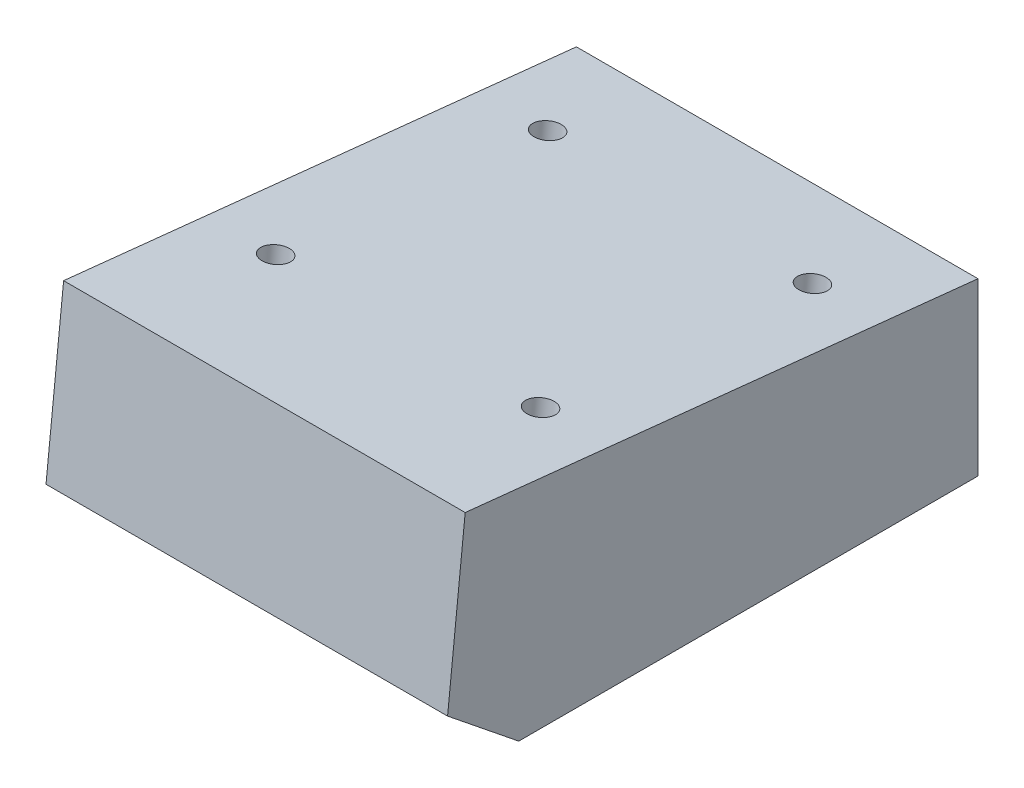
ISO-10303-21;
HEADER;
FILE_DESCRIPTION(('STEP AP214'),'2;1');
FILE_NAME('part.step','',(''),(''),'','','');
FILE_SCHEMA(('AUTOMOTIVE_DESIGN { 1 0 10303 214 1 1 1 1 }'));
ENDSEC;
DATA;
#1=APPLICATION_CONTEXT('core data for automotive mechanical design processes');
#2=APPLICATION_PROTOCOL_DEFINITION('international standard','automotive_design',2000,#1);
#3=PRODUCT_CONTEXT('',#1,'mechanical');
#4=PRODUCT('Part','Part','',(#3));
#5=PRODUCT_RELATED_PRODUCT_CATEGORY('part','',(#4));
#6=PRODUCT_DEFINITION_FORMATION('','',#4);
#7=PRODUCT_DEFINITION_CONTEXT('part definition',#1,'design');
#8=PRODUCT_DEFINITION('design','',#6,#7);
#9=PRODUCT_DEFINITION_SHAPE('','',#8);
#10=(LENGTH_UNIT() NAMED_UNIT(*) SI_UNIT(.MILLI.,.METRE.));
#11=(NAMED_UNIT(*) PLANE_ANGLE_UNIT() SI_UNIT($,.RADIAN.));
#12=(NAMED_UNIT(*) SI_UNIT($,.STERADIAN.) SOLID_ANGLE_UNIT());
#13=UNCERTAINTY_MEASURE_WITH_UNIT(LENGTH_MEASURE(1.E-05),#10,'distance_accuracy_value','');
#14=(GEOMETRIC_REPRESENTATION_CONTEXT(3) GLOBAL_UNCERTAINTY_ASSIGNED_CONTEXT((#13)) GLOBAL_UNIT_ASSIGNED_CONTEXT((#10,
#11,#12)) REPRESENTATION_CONTEXT('',''));
#15=CARTESIAN_POINT('',(0.,0.,0.));
#16=DIRECTION('',(0.,0.,1.));
#17=DIRECTION('',(1.,0.,0.));
#18=AXIS2_PLACEMENT_3D('',#15,#16,#17);
#19=CARTESIAN_POINT('',(-91.9229512232597,0.,0.));
#20=DIRECTION('',(0.,-1.,0.));
#21=DIRECTION('',(0.,0.,-1.));
#22=AXIS2_PLACEMENT_3D('',#19,#20,#21);
#23=PLANE('',#22);
#24=DIRECTION('',(0.,0.,-1.));
#25=VECTOR('',#24,1.);
#26=CARTESIAN_POINT('',(-22.5999999999999,0.,0.));
#27=LINE('',#26,#25);
#28=CARTESIAN_POINT('',(-22.5999999999999,0.,0.));
#29=VERTEX_POINT('',#28);
#30=CARTESIAN_POINT('',(-22.5999999999999,0.,-53.75));
#31=VERTEX_POINT('',#30);
#32=EDGE_CURVE('E153',#29,#31,#27,.T.);
#33=ORIENTED_EDGE('',*,*,#32,.F.);
#34=DIRECTION('',(1.,0.,0.));
#35=VECTOR('',#34,1.);
#36=CARTESIAN_POINT('',(-91.9229512232597,0.,0.));
#37=LINE('',#36,#35);
#38=CARTESIAN_POINT('',(-23.4999999999999,0.,0.));
#39=VERTEX_POINT('',#38);
#40=EDGE_CURVE('E212',#39,#29,#37,.T.);
#41=ORIENTED_EDGE('',*,*,#40,.F.);
#42=DIRECTION('',(0.,0.,1.));
#43=VECTOR('',#42,1.);
#44=CARTESIAN_POINT('',(-23.4999999999999,0.,0.));
#45=LINE('',#44,#43);
#46=CARTESIAN_POINT('',(-23.4999999999999,0.,-53.75));
#47=VERTEX_POINT('',#46);
#48=EDGE_CURVE('E198',#47,#39,#45,.T.);
#49=ORIENTED_EDGE('',*,*,#48,.F.);
#50=DIRECTION('',(1.,0.,0.));
#51=VECTOR('',#50,1.);
#52=CARTESIAN_POINT('',(-91.9229512232597,0.,-53.75));
#53=LINE('',#52,#51);
#54=EDGE_CURVE('E208',#47,#31,#53,.T.);
#55=ORIENTED_EDGE('',*,*,#54,.T.);
#56=EDGE_LOOP('',(#33,#41,#49,#55));
#57=FACE_BOUND('',#56,.T.);
#58=ADVANCED_FACE('F33',(#57),#23,.T.);
#59=CARTESIAN_POINT('',(-91.9229512232597,6.70267714112102,8.32847136590357));
#60=DIRECTION('',(0.,0.104528463267645,0.994521895368274));
#61=DIRECTION('',(0.,-0.994521895368274,0.104528463267645));
#62=AXIS2_PLACEMENT_3D('',#59,#60,#61);
#63=PLANE('',#62);
#64=DIRECTION('',(0.,0.994521895368274,-0.104528463267645));
#65=VECTOR('',#64,1.);
#66=CARTESIAN_POINT('',(-23.4999999999999,6.70267714112102,8.32847136590357));
#67=LINE('',#66,#65);
#68=CARTESIAN_POINT('',(-23.4999999999999,6.70267714112102,8.32847136590357));
#69=VERTEX_POINT('',#68);
#70=CARTESIAN_POINT('',(-23.4999999999999,26.3081307683911,6.26785515537283));
#71=VERTEX_POINT('',#70);
#72=EDGE_CURVE('E41',#69,#71,#67,.T.);
#73=ORIENTED_EDGE('',*,*,#72,.F.);
#74=DIRECTION('',(1.,0.,0.));
#75=VECTOR('',#74,1.);
#76=CARTESIAN_POINT('',(-91.9229512232597,6.70267714112102,8.32847136590357));
#77=LINE('',#76,#75);
#78=CARTESIAN_POINT('',(23.4999999999999,6.70267714112102,8.32847136590357));
#79=VERTEX_POINT('',#78);
#80=EDGE_CURVE('E195',#69,#79,#77,.T.);
#81=ORIENTED_EDGE('',*,*,#80,.T.);
#82=DIRECTION('',(0.,0.994521895368274,-0.104528463267645));
#83=VECTOR('',#82,1.);
#84=CARTESIAN_POINT('',(23.4999999999999,6.70267714112102,8.32847136590357));
#85=LINE('',#84,#83);
#86=CARTESIAN_POINT('',(23.4999999999999,26.3081307683911,6.26785515537283));
#87=VERTEX_POINT('',#86);
#88=EDGE_CURVE('E192',#79,#87,#85,.T.);
#89=ORIENTED_EDGE('',*,*,#88,.T.);
#90=DIRECTION('',(1.,0.,0.));
#91=VECTOR('',#90,1.);
#92=CARTESIAN_POINT('',(-91.9229512232597,26.3081307683911,6.26785515537283));
#93=LINE('',#92,#91);
#94=EDGE_CURVE('E200',#71,#87,#93,.T.);
#95=ORIENTED_EDGE('',*,*,#94,.F.);
#96=EDGE_LOOP('',(#73,#81,#89,#95));
#97=FACE_BOUND('',#96,.T.);
#98=ADVANCED_FACE('F35',(#97),#63,.T.);
#99=CARTESIAN_POINT('',(-91.9229512232597,20.,-53.75));
#100=DIRECTION('',(0.,0.994521895368274,-0.104528463267646));
#101=DIRECTION('',(0.,0.104528463267646,0.994521895368274));
#102=AXIS2_PLACEMENT_3D('',#99,#100,#101);
#103=PLANE('',#102);
#104=CARTESIAN_POINT('',(-15.5,24.5402929855246,-10.5519978067653));
#105=DIRECTION('',(0.,0.994521895368274,-0.104528463267646));
#106=DIRECTION('',(0.,0.104528463267646,0.994521895368274));
#107=AXIS2_PLACEMENT_3D('',#104,#105,#106);
#108=CIRCLE('',#107,1.6);
#109=CARTESIAN_POINT('',(-15.5,24.7075385267529,-8.9607627741761));
#110=VERTEX_POINT('',#109);
#111=EDGE_CURVE('E132',#110,#110,#108,.T.);
#112=ORIENTED_EDGE('',*,*,#111,.F.);
#113=EDGE_LOOP('',(#112));
#114=FACE_BOUND('',#113,.T.);
#115=CARTESIAN_POINT('',(15.5,24.5402929855246,-10.5519978067653));
#116=DIRECTION('',(0.,0.994521895368274,-0.104528463267646));
#117=DIRECTION('',(0.,0.104528463267646,0.994521895368274));
#118=AXIS2_PLACEMENT_3D('',#115,#116,#117);
#119=CIRCLE('',#118,1.6);
#120=CARTESIAN_POINT('',(15.5,24.7075385267529,-8.9607627741761));
#121=VERTEX_POINT('',#120);
#122=EDGE_CURVE('E138',#121,#121,#119,.T.);
#123=ORIENTED_EDGE('',*,*,#122,.F.);
#124=EDGE_LOOP('',(#123));
#125=FACE_BOUND('',#124,.T.);
#126=CARTESIAN_POINT('',(15.5,21.1953821609599,-42.3766984585501));
#127=DIRECTION('',(0.,0.994521895368274,-0.104528463267646));
#128=DIRECTION('',(0.,0.104528463267646,0.994521895368274));
#129=AXIS2_PLACEMENT_3D('',#126,#127,#128);
#130=CIRCLE('',#129,1.6);
#131=CARTESIAN_POINT('',(15.5,21.3626277021882,-40.7854634259609));
#132=VERTEX_POINT('',#131);
#133=EDGE_CURVE('E144',#132,#132,#130,.T.);
#134=ORIENTED_EDGE('',*,*,#133,.F.);
#135=EDGE_LOOP('',(#134));
#136=FACE_BOUND('',#135,.T.);
#137=CARTESIAN_POINT('',(-15.5,21.1953821609599,-42.3766984585501));
#138=DIRECTION('',(0.,0.994521895368274,-0.104528463267646));
#139=DIRECTION('',(0.,0.104528463267646,0.994521895368274));
#140=AXIS2_PLACEMENT_3D('',#137,#138,#139);
#141=CIRCLE('',#140,1.60000000000001);
#142=CARTESIAN_POINT('',(-15.5,21.3626277021882,-40.7854634259609));
#143=VERTEX_POINT('',#142);
#144=EDGE_CURVE('E150',#143,#143,#141,.T.);
#145=ORIENTED_EDGE('',*,*,#144,.F.);
#146=EDGE_LOOP('',(#145));
#147=FACE_BOUND('',#146,.T.);
#148=DIRECTION('',(0.,-0.104528463267646,-0.994521895368274));
#149=VECTOR('',#148,1.);
#150=CARTESIAN_POINT('',(-23.4999999999999,20.,-53.75));
#151=LINE('',#150,#149);
#152=CARTESIAN_POINT('',(-23.4999999999999,20.,-53.75));
#153=VERTEX_POINT('',#152);
#154=EDGE_CURVE('E202',#71,#153,#151,.T.);
#155=ORIENTED_EDGE('',*,*,#154,.F.);
#156=ORIENTED_EDGE('',*,*,#94,.T.);
#157=DIRECTION('',(0.,-0.104528463267646,-0.994521895368274));
#158=VECTOR('',#157,1.);
#159=CARTESIAN_POINT('',(23.4999999999999,20.,-53.75));
#160=LINE('',#159,#158);
#161=CARTESIAN_POINT('',(23.4999999999999,20.,-53.75));
#162=VERTEX_POINT('',#161);
#163=EDGE_CURVE('E176',#87,#162,#160,.T.);
#164=ORIENTED_EDGE('',*,*,#163,.T.);
#165=DIRECTION('',(1.,0.,0.));
#166=VECTOR('',#165,1.);
#167=CARTESIAN_POINT('',(-91.9229512232597,20.,-53.75));
#168=LINE('',#167,#166);
#169=EDGE_CURVE('E206',#153,#162,#168,.T.);
#170=ORIENTED_EDGE('',*,*,#169,.F.);
#171=EDGE_LOOP('',(#155,#156,#164,#170));
#172=FACE_BOUND('',#171,.T.);
#173=ADVANCED_FACE('F237',(#114,#125,#136,#147,#172),#103,.T.);
#174=CARTESIAN_POINT('',(-91.9229512232597,0.,-53.75));
#175=DIRECTION('',(0.,0.,-1.));
#176=DIRECTION('',(-1.,0.,0.));
#177=AXIS2_PLACEMENT_3D('',#174,#175,#176);
#178=PLANE('',#177);
#179=DIRECTION('',(0.,-1.,0.));
#180=VECTOR('',#179,1.);
#181=CARTESIAN_POINT('',(-22.5999999999999,4.05,-53.75));
#182=LINE('',#181,#180);
#183=CARTESIAN_POINT('',(-22.5999999999999,4.05,-53.75));
#184=VERTEX_POINT('',#183);
#185=EDGE_CURVE('E169',#184,#31,#182,.T.);
#186=ORIENTED_EDGE('',*,*,#185,.T.);
#187=ORIENTED_EDGE('',*,*,#54,.F.);
#188=DIRECTION('',(0.,-1.,0.));
#189=VECTOR('',#188,1.);
#190=CARTESIAN_POINT('',(-23.4999999999999,0.,-53.75));
#191=LINE('',#190,#189);
#192=EDGE_CURVE('E57',#153,#47,#191,.T.);
#193=ORIENTED_EDGE('',*,*,#192,.F.);
#194=ORIENTED_EDGE('',*,*,#169,.T.);
#195=DIRECTION('',(0.,-1.,0.));
#196=VECTOR('',#195,1.);
#197=CARTESIAN_POINT('',(23.4999999999999,0.,-53.75));
#198=LINE('',#197,#196);
#199=CARTESIAN_POINT('',(23.4999999999999,0.,-53.75));
#200=VERTEX_POINT('',#199);
#201=EDGE_CURVE('E183',#162,#200,#198,.T.);
#202=ORIENTED_EDGE('',*,*,#201,.T.);
#203=CARTESIAN_POINT('',(22.5999999999999,0.,-53.75));
#204=VERTEX_POINT('',#203);
#205=EDGE_CURVE('E211',#204,#200,#53,.T.);
#206=ORIENTED_EDGE('',*,*,#205,.F.);
#207=DIRECTION('',(0.,-1.,0.));
#208=VECTOR('',#207,1.);
#209=CARTESIAN_POINT('',(22.5999999999999,4.05,-53.75));
#210=LINE('',#209,#208);
#211=CARTESIAN_POINT('',(22.5999999999999,4.05,-53.75));
#212=VERTEX_POINT('',#211);
#213=EDGE_CURVE('E179',#212,#204,#210,.T.);
#214=ORIENTED_EDGE('',*,*,#213,.F.);
#215=DIRECTION('',(1.,0.,0.));
#216=VECTOR('',#215,1.);
#217=CARTESIAN_POINT('',(-22.5999999999999,4.05,-53.75));
#218=LINE('',#217,#216);
#219=EDGE_CURVE('E159',#184,#212,#218,.T.);
#220=ORIENTED_EDGE('',*,*,#219,.F.);
#221=EDGE_LOOP('',(#186,#187,#193,#194,#202,#206,#214,#220));
#222=FACE_BOUND('',#221,.T.);
#223=ADVANCED_FACE('F233',(#222),#178,.T.);
#224=DIRECTION('',(0.,0.,1.));
#225=VECTOR('',#224,1.);
#226=CARTESIAN_POINT('',(22.5999999999999,0.,0.));
#227=LINE('',#226,#225);
#228=CARTESIAN_POINT('',(22.5999999999999,0.,0.));
#229=VERTEX_POINT('',#228);
#230=EDGE_CURVE('E48',#204,#229,#227,.T.);
#231=ORIENTED_EDGE('',*,*,#230,.F.);
#232=ORIENTED_EDGE('',*,*,#205,.T.);
#233=DIRECTION('',(0.,0.,1.));
#234=VECTOR('',#233,1.);
#235=CARTESIAN_POINT('',(23.4999999999999,0.,0.));
#236=LINE('',#235,#234);
#237=CARTESIAN_POINT('',(23.4999999999999,0.,0.));
#238=VERTEX_POINT('',#237);
#239=EDGE_CURVE('E186',#200,#238,#236,.T.);
#240=ORIENTED_EDGE('',*,*,#239,.T.);
#241=EDGE_CURVE('E214',#229,#238,#37,.T.);
#242=ORIENTED_EDGE('',*,*,#241,.F.);
#243=EDGE_LOOP('',(#231,#232,#240,#242));
#244=FACE_BOUND('',#243,.T.);
#245=ADVANCED_FACE('F229',(#244),#23,.T.);
#246=CARTESIAN_POINT('',(-91.9229512232597,0.,0.));
#247=DIRECTION('',(0.,-0.779044883952261,0.626968156119438));
#248=DIRECTION('',(0.,-0.626968156119438,-0.779044883952261));
#249=AXIS2_PLACEMENT_3D('',#246,#247,#248);
#250=PLANE('',#249);
#251=CARTESIAN_POINT('',(-13.4999999999999,3.4785766463036,4.32233649075853));
#252=DIRECTION('',(0.,-0.779044883952261,0.626968156119438));
#253=DIRECTION('',(0.,-0.626968156119438,-0.779044883952261));
#254=AXIS2_PLACEMENT_3D('',#251,#252,#253);
#255=CIRCLE('',#254,1.24999999999999);
#256=CARTESIAN_POINT('',(-13.4999999999999,2.69486645115431,3.34853038581821));
#257=VERTEX_POINT('',#256);
#258=EDGE_CURVE('E121',#257,#257,#255,.T.);
#259=ORIENTED_EDGE('',*,*,#258,.F.);
#260=EDGE_LOOP('',(#259));
#261=FACE_BOUND('',#260,.T.);
#262=CARTESIAN_POINT('',(13.4999999999999,3.4785766463036,4.32233649075852));
#263=DIRECTION('',(0.,-0.779044883952261,0.626968156119438));
#264=DIRECTION('',(0.,-0.626968156119438,-0.779044883952261));
#265=AXIS2_PLACEMENT_3D('',#262,#263,#264);
#266=CIRCLE('',#265,1.24999999999999);
#267=CARTESIAN_POINT('',(13.4999999999999,2.69486645115431,3.34853038581821));
#268=VERTEX_POINT('',#267);
#269=EDGE_CURVE('E120',#268,#268,#266,.T.);
#270=ORIENTED_EDGE('',*,*,#269,.F.);
#271=EDGE_LOOP('',(#270));
#272=FACE_BOUND('',#271,.T.);
#273=DIRECTION('',(0.,0.626968156119438,0.779044883952261));
#274=VECTOR('',#273,1.);
#275=CARTESIAN_POINT('',(-23.4999999999999,0.,0.));
#276=LINE('',#275,#274);
#277=EDGE_CURVE('E11',#39,#69,#276,.T.);
#278=ORIENTED_EDGE('',*,*,#277,.F.);
#279=ORIENTED_EDGE('',*,*,#40,.T.);
#280=DIRECTION('',(-1.,0.,0.));
#281=VECTOR('',#280,1.);
#282=CARTESIAN_POINT('',(-22.5999999999999,0.,0.));
#283=LINE('',#282,#281);
#284=EDGE_CURVE('E160',#229,#29,#283,.T.);
#285=ORIENTED_EDGE('',*,*,#284,.F.);
#286=ORIENTED_EDGE('',*,*,#241,.T.);
#287=DIRECTION('',(0.,0.626968156119438,0.779044883952261));
#288=VECTOR('',#287,1.);
#289=CARTESIAN_POINT('',(23.4999999999999,0.,0.));
#290=LINE('',#289,#288);
#291=EDGE_CURVE('E189',#238,#79,#290,.T.);
#292=ORIENTED_EDGE('',*,*,#291,.T.);
#293=ORIENTED_EDGE('',*,*,#80,.F.);
#294=EDGE_LOOP('',(#278,#279,#285,#286,#292,#293));
#295=FACE_BOUND('',#294,.T.);
#296=ADVANCED_FACE('F222',(#261,#272,#295),#250,.T.);
#297=CARTESIAN_POINT('',(-23.4999999999999,0.0499999999999997,0.));
#298=DIRECTION('',(1.,0.,0.));
#299=DIRECTION('',(0.,0.,-1.));
#300=AXIS2_PLACEMENT_3D('',#297,#298,#299);
#301=PLANE('',#300);
#302=ORIENTED_EDGE('',*,*,#72,.T.);
#303=ORIENTED_EDGE('',*,*,#154,.T.);
#304=ORIENTED_EDGE('',*,*,#192,.T.);
#305=ORIENTED_EDGE('',*,*,#48,.T.);
#306=ORIENTED_EDGE('',*,*,#277,.T.);
#307=EDGE_LOOP('',(#302,#303,#304,#305,#306));
#308=FACE_BOUND('',#307,.T.);
#309=ADVANCED_FACE('F274',(#308),#301,.F.);
#310=CARTESIAN_POINT('',(23.4999999999999,0.0499999999999997,0.));
#311=DIRECTION('',(-1.,0.,0.));
#312=DIRECTION('',(0.,0.,1.));
#313=AXIS2_PLACEMENT_3D('',#310,#311,#312);
#314=PLANE('',#313);
#315=ORIENTED_EDGE('',*,*,#291,.F.);
#316=ORIENTED_EDGE('',*,*,#239,.F.);
#317=ORIENTED_EDGE('',*,*,#201,.F.);
#318=ORIENTED_EDGE('',*,*,#163,.F.);
#319=ORIENTED_EDGE('',*,*,#88,.F.);
#320=EDGE_LOOP('',(#315,#316,#317,#318,#319));
#321=FACE_BOUND('',#320,.T.);
#322=ADVANCED_FACE('F226',(#321),#314,.F.);
#323=CARTESIAN_POINT('',(-22.5999999999999,4.05,0.));
#324=DIRECTION('',(-1.,0.,0.));
#325=DIRECTION('',(0.,0.,1.));
#326=AXIS2_PLACEMENT_3D('',#323,#324,#325);
#327=PLANE('',#326);
#328=ORIENTED_EDGE('',*,*,#32,.T.);
#329=ORIENTED_EDGE('',*,*,#185,.F.);
#330=DIRECTION('',(0.,0.,-1.));
#331=VECTOR('',#330,1.);
#332=CARTESIAN_POINT('',(-22.5999999999999,4.05,0.));
#333=LINE('',#332,#331);
#334=CARTESIAN_POINT('',(-22.5999999999999,4.05,0.));
#335=VERTEX_POINT('',#334);
#336=EDGE_CURVE('E156',#335,#184,#333,.T.);
#337=ORIENTED_EDGE('',*,*,#336,.F.);
#338=DIRECTION('',(0.,-1.,0.));
#339=VECTOR('',#338,1.);
#340=CARTESIAN_POINT('',(-22.5999999999999,4.05,0.));
#341=LINE('',#340,#339);
#342=EDGE_CURVE('E174',#335,#29,#341,.T.);
#343=ORIENTED_EDGE('',*,*,#342,.T.);
#344=EDGE_LOOP('',(#328,#329,#337,#343));
#345=FACE_BOUND('',#344,.T.);
#346=ADVANCED_FACE('F244',(#345),#327,.F.);
#347=CARTESIAN_POINT('',(-22.5999999999999,4.05,0.));
#348=DIRECTION('',(0.,0.,1.));
#349=DIRECTION('',(1.,0.,0.));
#350=AXIS2_PLACEMENT_3D('',#347,#348,#349);
#351=PLANE('',#350);
#352=ORIENTED_EDGE('',*,*,#284,.T.);
#353=ORIENTED_EDGE('',*,*,#342,.F.);
#354=DIRECTION('',(-1.,0.,0.));
#355=VECTOR('',#354,1.);
#356=CARTESIAN_POINT('',(-22.5999999999999,4.05,0.));
#357=LINE('',#356,#355);
#358=CARTESIAN_POINT('',(22.5999999999999,4.05,0.));
#359=VERTEX_POINT('',#358);
#360=EDGE_CURVE('E166',#359,#335,#357,.T.);
#361=ORIENTED_EDGE('',*,*,#360,.F.);
#362=DIRECTION('',(0.,-1.,0.));
#363=VECTOR('',#362,1.);
#364=CARTESIAN_POINT('',(22.5999999999999,4.05,0.));
#365=LINE('',#364,#363);
#366=EDGE_CURVE('E177',#359,#229,#365,.T.);
#367=ORIENTED_EDGE('',*,*,#366,.T.);
#368=EDGE_LOOP('',(#352,#353,#361,#367));
#369=FACE_BOUND('',#368,.T.);
#370=ADVANCED_FACE('F250',(#369),#351,.F.);
#371=CARTESIAN_POINT('',(22.5999999999999,4.05,0.));
#372=DIRECTION('',(1.,0.,0.));
#373=DIRECTION('',(0.,0.,-1.));
#374=AXIS2_PLACEMENT_3D('',#371,#372,#373);
#375=PLANE('',#374);
#376=ORIENTED_EDGE('',*,*,#230,.T.);
#377=ORIENTED_EDGE('',*,*,#366,.F.);
#378=DIRECTION('',(0.,0.,1.));
#379=VECTOR('',#378,1.);
#380=CARTESIAN_POINT('',(22.5999999999999,4.05,0.));
#381=LINE('',#380,#379);
#382=EDGE_CURVE('E163',#212,#359,#381,.T.);
#383=ORIENTED_EDGE('',*,*,#382,.F.);
#384=ORIENTED_EDGE('',*,*,#213,.T.);
#385=EDGE_LOOP('',(#376,#377,#383,#384));
#386=FACE_BOUND('',#385,.T.);
#387=ADVANCED_FACE('F251',(#386),#375,.F.);
#388=CARTESIAN_POINT('',(0.,4.05,0.));
#389=DIRECTION('',(0.,-1.,0.));
#390=DIRECTION('',(0.,0.,-1.));
#391=AXIS2_PLACEMENT_3D('',#388,#389,#390);
#392=PLANE('',#391);
#393=CARTESIAN_POINT('',(-15.5,4.05,-8.39838123215227));
#394=DIRECTION('',(0.,-1.,0.));
#395=DIRECTION('',(0.,0.,-1.));
#396=AXIS2_PLACEMENT_3D('',#393,#394,#395);
#397=ELLIPSE('',#396,1.60881324730163,1.6);
#398=CARTESIAN_POINT('',(-15.5,4.05,-10.0071944794539));
#399=VERTEX_POINT('',#398);
#400=EDGE_CURVE('E131',#399,#399,#397,.F.);
#401=ORIENTED_EDGE('',*,*,#400,.T.);
#402=EDGE_LOOP('',(#401));
#403=FACE_BOUND('',#402,.T.);
#404=CARTESIAN_POINT('',(15.5,4.05,-8.39838123215227));
#405=DIRECTION('',(0.,-1.,0.));
#406=DIRECTION('',(0.,0.,-1.));
#407=AXIS2_PLACEMENT_3D('',#404,#405,#406);
#408=ELLIPSE('',#407,1.60881324730163,1.6);
#409=CARTESIAN_POINT('',(15.5,4.05,-10.0071944794539));
#410=VERTEX_POINT('',#409);
#411=EDGE_CURVE('E135',#410,#410,#408,.F.);
#412=ORIENTED_EDGE('',*,*,#411,.T.);
#413=EDGE_LOOP('',(#412));
#414=FACE_BOUND('',#413,.T.);
#415=CARTESIAN_POINT('',(15.5,4.05,-40.5746461781848));
#416=DIRECTION('',(0.,-1.,0.));
#417=DIRECTION('',(0.,0.,-1.));
#418=AXIS2_PLACEMENT_3D('',#415,#416,#417);
#419=ELLIPSE('',#418,1.60881324730163,1.6);
#420=CARTESIAN_POINT('',(15.5,4.05,-42.1834594254864));
#421=VERTEX_POINT('',#420);
#422=EDGE_CURVE('E141',#421,#421,#419,.F.);
#423=ORIENTED_EDGE('',*,*,#422,.T.);
#424=EDGE_LOOP('',(#423));
#425=FACE_BOUND('',#424,.T.);
#426=CARTESIAN_POINT('',(-15.5,4.05,-40.5746461781848));
#427=DIRECTION('',(0.,-1.,0.));
#428=DIRECTION('',(0.,0.,-1.));
#429=AXIS2_PLACEMENT_3D('',#426,#427,#428);
#430=ELLIPSE('',#429,1.60881324730163,1.60000000000001);
#431=CARTESIAN_POINT('',(-15.5,4.05,-42.1834594254864));
#432=VERTEX_POINT('',#431);
#433=EDGE_CURVE('E147',#432,#432,#430,.F.);
#434=ORIENTED_EDGE('',*,*,#433,.T.);
#435=EDGE_LOOP('',(#434));
#436=FACE_BOUND('',#435,.T.);
#437=ORIENTED_EDGE('',*,*,#336,.T.);
#438=ORIENTED_EDGE('',*,*,#219,.T.);
#439=ORIENTED_EDGE('',*,*,#382,.T.);
#440=ORIENTED_EDGE('',*,*,#360,.T.);
#441=EDGE_LOOP('',(#437,#438,#439,#440));
#442=FACE_BOUND('',#441,.T.);
#443=ADVANCED_FACE('F247',(#403,#414,#425,#436,#442),#392,.T.);
#444=CARTESIAN_POINT('',(-15.5,-5.04060684855692,-39.6191848972663));
#445=DIRECTION('',(0.,0.994521895368274,-0.104528463267646));
#446=DIRECTION('',(0.,0.104528463267646,0.994521895368274));
#447=AXIS2_PLACEMENT_3D('',#444,#445,#446);
#448=CYLINDRICAL_SURFACE('',#447,1.60000000000001);
#449=ORIENTED_EDGE('',*,*,#433,.F.);
#450=EDGE_LOOP('',(#449));
#451=FACE_BOUND('',#450,.T.);
#452=ORIENTED_EDGE('',*,*,#144,.T.);
#453=EDGE_LOOP('',(#452));
#454=FACE_BOUND('',#453,.T.);
#455=ADVANCED_FACE('F258',(#451,#454),#448,.F.);
#456=CARTESIAN_POINT('',(15.5,-5.04060684855692,-39.6191848972663));
#457=DIRECTION('',(0.,0.994521895368274,-0.104528463267646));
#458=DIRECTION('',(0.,0.104528463267646,0.994521895368274));
#459=AXIS2_PLACEMENT_3D('',#456,#457,#458);
#460=CYLINDRICAL_SURFACE('',#459,1.6);
#461=ORIENTED_EDGE('',*,*,#422,.F.);
#462=EDGE_LOOP('',(#461));
#463=FACE_BOUND('',#462,.T.);
#464=ORIENTED_EDGE('',*,*,#133,.T.);
#465=EDGE_LOOP('',(#464));
#466=FACE_BOUND('',#465,.T.);
#467=ADVANCED_FACE('F321',(#463,#466),#460,.F.);
#468=CARTESIAN_POINT('',(15.5,-1.69569602399224,-7.79448424548157));
#469=DIRECTION('',(0.,0.994521895368274,-0.104528463267646));
#470=DIRECTION('',(0.,0.104528463267646,0.994521895368274));
#471=AXIS2_PLACEMENT_3D('',#468,#469,#470);
#472=CYLINDRICAL_SURFACE('',#471,1.6);
#473=ORIENTED_EDGE('',*,*,#411,.F.);
#474=EDGE_LOOP('',(#473));
#475=FACE_BOUND('',#474,.T.);
#476=ORIENTED_EDGE('',*,*,#122,.T.);
#477=EDGE_LOOP('',(#476));
#478=FACE_BOUND('',#477,.T.);
#479=ADVANCED_FACE('F331',(#475,#478),#472,.F.);
#480=CARTESIAN_POINT('',(-15.5,-1.69569602399224,-7.79448424548157));
#481=DIRECTION('',(0.,0.994521895368274,-0.104528463267646));
#482=DIRECTION('',(0.,0.104528463267646,0.994521895368274));
#483=AXIS2_PLACEMENT_3D('',#480,#481,#482);
#484=CYLINDRICAL_SURFACE('',#483,1.6);
#485=ORIENTED_EDGE('',*,*,#400,.F.);
#486=EDGE_LOOP('',(#485));
#487=FACE_BOUND('',#486,.T.);
#488=ORIENTED_EDGE('',*,*,#111,.T.);
#489=EDGE_LOOP('',(#488));
#490=FACE_BOUND('',#489,.T.);
#491=ADVANCED_FACE('F341',(#487,#490),#484,.F.);
#492=CARTESIAN_POINT('',(13.4999999999999,7.37380106606491,1.18749571016133));
#493=DIRECTION('',(0.,-0.779044883952261,0.626968156119438));
#494=DIRECTION('',(0.,-0.626968156119438,-0.779044883952261));
#495=AXIS2_PLACEMENT_3D('',#492,#493,#494);
#496=CONICAL_SURFACE('',#495,1.24999999999999,1.02974425867665);
#497=CARTESIAN_POINT('',(13.4999999999999,7.95892280509217,0.716595117165716));
#498=VERTEX_POINT('',#497);
#499=VERTEX_LOOP('',#498);
#500=FACE_BOUND('',#499,.T.);
#501=CARTESIAN_POINT('',(13.4999999999999,7.37380106606491,1.18749571016133));
#502=DIRECTION('',(0.,-0.779044883952261,0.626968156119438));
#503=DIRECTION('',(0.,-0.626968156119438,-0.779044883952261));
#504=AXIS2_PLACEMENT_3D('',#501,#502,#503);
#505=CIRCLE('',#504,1.24999999999999);
#506=CARTESIAN_POINT('',(13.4999999999999,6.59009087091562,0.213689605221013));
#507=VERTEX_POINT('',#506);
#508=EDGE_CURVE('E124',#507,#507,#505,.T.);
#509=ORIENTED_EDGE('',*,*,#508,.T.);
#510=EDGE_LOOP('',(#509));
#511=FACE_BOUND('',#510,.T.);
#512=ADVANCED_FACE('F351',(#500,#511),#496,.F.);
#513=CARTESIAN_POINT('',(13.4999999999999,3.4785766463036,4.32233649075852));
#514=DIRECTION('',(0.,-0.779044883952261,0.626968156119438));
#515=DIRECTION('',(0.,-0.626968156119438,-0.779044883952261));
#516=AXIS2_PLACEMENT_3D('',#513,#514,#515);
#517=CYLINDRICAL_SURFACE('',#516,1.24999999999999);
#518=ORIENTED_EDGE('',*,*,#508,.F.);
#519=EDGE_LOOP('',(#518));
#520=FACE_BOUND('',#519,.T.);
#521=ORIENTED_EDGE('',*,*,#269,.T.);
#522=EDGE_LOOP('',(#521));
#523=FACE_BOUND('',#522,.T.);
#524=ADVANCED_FACE('F114',(#520,#523),#517,.F.);
#525=CARTESIAN_POINT('',(-13.4999999999999,7.37380106606491,1.18749571016133));
#526=DIRECTION('',(0.,-0.779044883952261,0.626968156119438));
#527=DIRECTION('',(0.,-0.626968156119438,-0.779044883952261));
#528=AXIS2_PLACEMENT_3D('',#525,#526,#527);
#529=CONICAL_SURFACE('',#528,1.24999999999999,1.02974425867665);
#530=CARTESIAN_POINT('',(-13.4999999999999,7.95892280509217,0.716595117165718));
#531=VERTEX_POINT('',#530);
#532=VERTEX_LOOP('',#531);
#533=FACE_BOUND('',#532,.T.);
#534=CARTESIAN_POINT('',(-13.4999999999999,7.37380106606491,1.18749571016133));
#535=DIRECTION('',(0.,-0.779044883952261,0.626968156119438));
#536=DIRECTION('',(0.,-0.626968156119438,-0.779044883952261));
#537=AXIS2_PLACEMENT_3D('',#534,#535,#536);
#538=CIRCLE('',#537,1.24999999999999);
#539=CARTESIAN_POINT('',(-13.4999999999999,6.59009087091562,0.213689605221015));
#540=VERTEX_POINT('',#539);
#541=EDGE_CURVE('E118',#540,#540,#538,.T.);
#542=ORIENTED_EDGE('',*,*,#541,.T.);
#543=EDGE_LOOP('',(#542));
#544=FACE_BOUND('',#543,.T.);
#545=ADVANCED_FACE('F110',(#533,#544),#529,.F.);
#546=CARTESIAN_POINT('',(-13.4999999999999,3.4785766463036,4.32233649075853));
#547=DIRECTION('',(0.,-0.779044883952261,0.626968156119438));
#548=DIRECTION('',(0.,-0.626968156119438,-0.779044883952261));
#549=AXIS2_PLACEMENT_3D('',#546,#547,#548);
#550=CYLINDRICAL_SURFACE('',#549,1.24999999999999);
#551=ORIENTED_EDGE('',*,*,#541,.F.);
#552=EDGE_LOOP('',(#551));
#553=FACE_BOUND('',#552,.T.);
#554=ORIENTED_EDGE('',*,*,#258,.T.);
#555=EDGE_LOOP('',(#554));
#556=FACE_BOUND('',#555,.T.);
#557=ADVANCED_FACE('F113',(#553,#556),#550,.F.);
#558=CLOSED_SHELL('',(#58,#98,#173,#223,#245,#296,#309,#322,#346,#370,#387,#443,#455,#467,#479,
#491,#512,#524,#545,#557));
#559=MANIFOLD_SOLID_BREP('B2',#558);
#560=ADVANCED_BREP_SHAPE_REPRESENTATION('',(#18,#559),#14);
#561=SHAPE_DEFINITION_REPRESENTATION(#9,#560);
ENDSEC;
END-ISO-10303-21;
